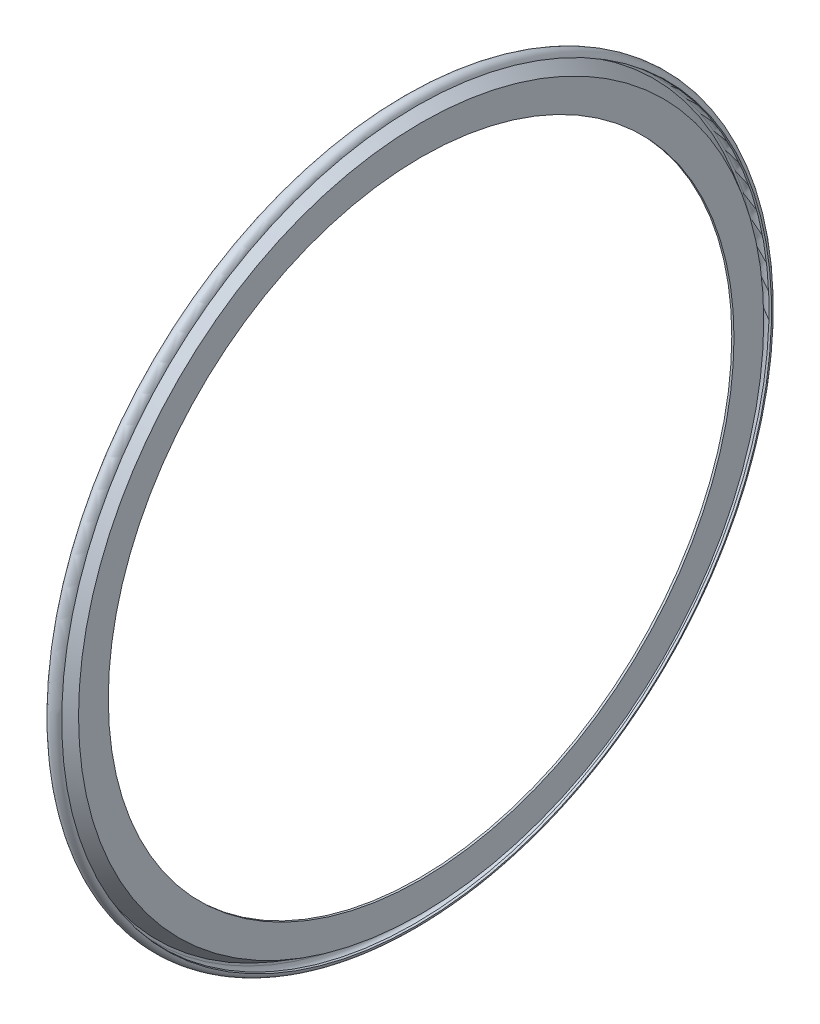
ISO-10303-21;
HEADER;
FILE_DESCRIPTION(('STEP AP214'),'2;1');
FILE_NAME('part.step','',(''),(''),'','','');
FILE_SCHEMA(('AUTOMOTIVE_DESIGN { 1 0 10303 214 1 1 1 1 }'));
ENDSEC;
DATA;
#1=APPLICATION_CONTEXT('core data for automotive mechanical design processes');
#2=APPLICATION_PROTOCOL_DEFINITION('international standard','automotive_design',2000,#1);
#3=PRODUCT_CONTEXT('',#1,'mechanical');
#4=PRODUCT('Part','Part','',(#3));
#5=PRODUCT_RELATED_PRODUCT_CATEGORY('part','',(#4));
#6=PRODUCT_DEFINITION_FORMATION('','',#4);
#7=PRODUCT_DEFINITION_CONTEXT('part definition',#1,'design');
#8=PRODUCT_DEFINITION('design','',#6,#7);
#9=PRODUCT_DEFINITION_SHAPE('','',#8);
#10=(LENGTH_UNIT() NAMED_UNIT(*) SI_UNIT(.MILLI.,.METRE.));
#11=(NAMED_UNIT(*) PLANE_ANGLE_UNIT() SI_UNIT($,.RADIAN.));
#12=(NAMED_UNIT(*) SI_UNIT($,.STERADIAN.) SOLID_ANGLE_UNIT());
#13=UNCERTAINTY_MEASURE_WITH_UNIT(LENGTH_MEASURE(1.E-05),#10,'distance_accuracy_value','');
#14=(GEOMETRIC_REPRESENTATION_CONTEXT(3) GLOBAL_UNCERTAINTY_ASSIGNED_CONTEXT((#13)) GLOBAL_UNIT_ASSIGNED_CONTEXT((#10,
#11,#12)) REPRESENTATION_CONTEXT('',''));
#15=CARTESIAN_POINT('',(0.,0.,0.));
#16=DIRECTION('',(0.,0.,1.));
#17=DIRECTION('',(1.,0.,0.));
#18=AXIS2_PLACEMENT_3D('',#15,#16,#17);
#19=CARTESIAN_POINT('',(2.955,0.,0.));
#20=DIRECTION('',(1.,0.,0.));
#21=DIRECTION('',(0.,1.,0.));
#22=AXIS2_PLACEMENT_3D('',#19,#20,#21);
#23=CYLINDRICAL_SURFACE('',#22,4.245);
#24=CARTESIAN_POINT('',(2.94,0.,0.));
#25=DIRECTION('',(-1.,0.,0.));
#26=DIRECTION('',(0.,1.,0.));
#27=AXIS2_PLACEMENT_3D('',#24,#25,#26);
#28=CIRCLE('',#27,4.245);
#29=CARTESIAN_POINT('',(2.94,4.245,0.));
#30=VERTEX_POINT('',#29);
#31=EDGE_CURVE('E10',#30,#30,#28,.T.);
#32=ORIENTED_EDGE('',*,*,#31,.T.);
#33=EDGE_LOOP('',(#32));
#34=FACE_BOUND('',#33,.T.);
#35=CARTESIAN_POINT('',(2.97,0.,0.));
#36=DIRECTION('',(-1.,0.,0.));
#37=DIRECTION('',(0.,1.,0.));
#38=AXIS2_PLACEMENT_3D('',#35,#36,#37);
#39=CIRCLE('',#38,4.245);
#40=CARTESIAN_POINT('',(2.97,4.245,0.));
#41=VERTEX_POINT('',#40);
#42=EDGE_CURVE('E59',#41,#41,#39,.T.);
#43=ORIENTED_EDGE('',*,*,#42,.F.);
#44=EDGE_LOOP('',(#43));
#45=FACE_BOUND('',#44,.T.);
#46=ADVANCED_FACE('F16',(#34,#45),#23,.F.);
#47=CARTESIAN_POINT('',(2.94,4.43821796769724,0.));
#48=DIRECTION('',(-1.,0.,0.));
#49=DIRECTION('',(0.,1.,0.));
#50=AXIS2_PLACEMENT_3D('',#47,#48,#49);
#51=PLANE('',#50);
#52=CARTESIAN_POINT('',(2.94,0.,0.));
#53=DIRECTION('',(-1.,0.,0.));
#54=DIRECTION('',(0.,1.,0.));
#55=AXIS2_PLACEMENT_3D('',#52,#53,#54);
#56=CIRCLE('',#55,4.63143593539449);
#57=CARTESIAN_POINT('',(2.94,4.63143593539449,0.));
#58=VERTEX_POINT('',#57);
#59=EDGE_CURVE('E26',#58,#58,#56,.T.);
#60=ORIENTED_EDGE('',*,*,#59,.T.);
#61=EDGE_LOOP('',(#60));
#62=FACE_BOUND('',#61,.T.);
#63=ORIENTED_EDGE('',*,*,#31,.F.);
#64=EDGE_LOOP('',(#63));
#65=FACE_BOUND('',#64,.T.);
#66=ADVANCED_FACE('F88',(#62,#65),#51,.T.);
#67=CARTESIAN_POINT('',(2.835,0.,0.));
#68=DIRECTION('',(-1.,0.,0.));
#69=DIRECTION('',(0.,1.,0.));
#70=AXIS2_PLACEMENT_3D('',#67,#68,#69);
#71=CONICAL_SURFACE('',#70,4.6920577136594,0.523598775598299);
#72=CARTESIAN_POINT('',(2.73,0.,0.));
#73=DIRECTION('',(-1.,0.,0.));
#74=DIRECTION('',(0.,1.,0.));
#75=AXIS2_PLACEMENT_3D('',#72,#73,#74);
#76=CIRCLE('',#75,4.75267949192431);
#77=CARTESIAN_POINT('',(2.73,4.75267949192431,0.));
#78=VERTEX_POINT('',#77);
#79=EDGE_CURVE('E67',#78,#78,#76,.T.);
#80=ORIENTED_EDGE('',*,*,#79,.T.);
#81=EDGE_LOOP('',(#80));
#82=FACE_BOUND('',#81,.T.);
#83=ORIENTED_EDGE('',*,*,#59,.F.);
#84=EDGE_LOOP('',(#83));
#85=FACE_BOUND('',#84,.T.);
#86=ADVANCED_FACE('F93',(#82,#85),#71,.F.);
#87=CARTESIAN_POINT('',(2.73,4.77633974596215,0.));
#88=DIRECTION('',(-1.,0.,0.));
#89=DIRECTION('',(0.,1.,0.));
#90=AXIS2_PLACEMENT_3D('',#87,#88,#89);
#91=PLANE('',#90);
#92=CARTESIAN_POINT('',(2.73,0.,0.));
#93=DIRECTION('',(-1.,0.,0.));
#94=DIRECTION('',(0.,1.,0.));
#95=AXIS2_PLACEMENT_3D('',#92,#93,#94);
#96=CIRCLE('',#95,4.8);
#97=CARTESIAN_POINT('',(2.73,4.8,0.));
#98=VERTEX_POINT('',#97);
#99=EDGE_CURVE('E70',#98,#98,#96,.T.);
#100=ORIENTED_EDGE('',*,*,#99,.T.);
#101=EDGE_LOOP('',(#100));
#102=FACE_BOUND('',#101,.T.);
#103=ORIENTED_EDGE('',*,*,#79,.F.);
#104=EDGE_LOOP('',(#103));
#105=FACE_BOUND('',#104,.T.);
#106=ADVANCED_FACE('F98',(#102,#105),#91,.T.);
#107=CARTESIAN_POINT('',(2.82,0.,0.));
#108=DIRECTION('',(-1.,0.,0.));
#109=DIRECTION('',(0.,0.,1.));
#110=AXIS2_PLACEMENT_3D('',#107,#108,#109);
#111=TOROIDAL_SURFACE('',#110,4.8,0.09);
#112=CARTESIAN_POINT('',(2.9086326977711,0.,0.));
#113=DIRECTION('',(-1.,0.,0.));
#114=DIRECTION('',(0.,1.,0.));
#115=AXIS2_PLACEMENT_3D('',#112,#113,#114);
#116=CIRCLE('',#115,4.81562833599002);
#117=CARTESIAN_POINT('',(2.9086326977711,4.81562833599002,0.));
#118=VERTEX_POINT('',#117);
#119=EDGE_CURVE('E20',#118,#118,#116,.T.);
#120=ORIENTED_EDGE('',*,*,#119,.T.);
#121=EDGE_LOOP('',(#120));
#122=FACE_BOUND('',#121,.T.);
#123=ORIENTED_EDGE('',*,*,#99,.F.);
#124=EDGE_LOOP('',(#123));
#125=FACE_BOUND('',#124,.T.);
#126=ADVANCED_FACE('F99',(#122,#125),#111,.T.);
#127=CARTESIAN_POINT('',(2.89386058147592,0.,0.));
#128=DIRECTION('',(1.,0.,0.));
#129=DIRECTION('',(0.,1.,0.));
#130=AXIS2_PLACEMENT_3D('',#127,#128,#129);
#131=CONICAL_SURFACE('',#130,4.81302361332502,0.174532925199443);
#132=CARTESIAN_POINT('',(2.87908846518074,0.,0.));
#133=DIRECTION('',(-1.,0.,0.));
#134=DIRECTION('',(0.,1.,0.));
#135=AXIS2_PLACEMENT_3D('',#132,#133,#134);
#136=CIRCLE('',#135,4.81041889066002);
#137=CARTESIAN_POINT('',(2.87908846518074,4.81041889066002,0.));
#138=VERTEX_POINT('',#137);
#139=EDGE_CURVE('E66',#138,#138,#136,.T.);
#140=ORIENTED_EDGE('',*,*,#139,.T.);
#141=EDGE_LOOP('',(#140));
#142=FACE_BOUND('',#141,.T.);
#143=ORIENTED_EDGE('',*,*,#119,.F.);
#144=EDGE_LOOP('',(#143));
#145=FACE_BOUND('',#144,.T.);
#146=ADVANCED_FACE('F101',(#142,#145),#131,.F.);
#147=CARTESIAN_POINT('',(2.82,0.,0.));
#148=DIRECTION('',(-1.,0.,0.));
#149=DIRECTION('',(0.,0.,1.));
#150=AXIS2_PLACEMENT_3D('',#147,#148,#149);
#151=TOROIDAL_SURFACE('',#150,4.8,0.06);
#152=CARTESIAN_POINT('',(2.76,0.,0.));
#153=DIRECTION('',(-1.,0.,0.));
#154=DIRECTION('',(0.,1.,0.));
#155=AXIS2_PLACEMENT_3D('',#152,#153,#154);
#156=CIRCLE('',#155,4.8);
#157=CARTESIAN_POINT('',(2.76,4.8,0.));
#158=VERTEX_POINT('',#157);
#159=EDGE_CURVE('E64',#158,#158,#156,.T.);
#160=ORIENTED_EDGE('',*,*,#159,.T.);
#161=EDGE_LOOP('',(#160));
#162=FACE_BOUND('',#161,.T.);
#163=ORIENTED_EDGE('',*,*,#139,.F.);
#164=EDGE_LOOP('',(#163));
#165=FACE_BOUND('',#164,.T.);
#166=ADVANCED_FACE('F85',(#162,#165),#151,.F.);
#167=CARTESIAN_POINT('',(2.76,4.785,0.));
#168=DIRECTION('',(1.,0.,0.));
#169=DIRECTION('',(0.,-1.,0.));
#170=AXIS2_PLACEMENT_3D('',#167,#168,#169);
#171=PLANE('',#170);
#172=CARTESIAN_POINT('',(2.76,0.,0.));
#173=DIRECTION('',(-1.,0.,0.));
#174=DIRECTION('',(0.,1.,0.));
#175=AXIS2_PLACEMENT_3D('',#172,#173,#174);
#176=CIRCLE('',#175,4.77);
#177=CARTESIAN_POINT('',(2.76,4.77,0.));
#178=VERTEX_POINT('',#177);
#179=EDGE_CURVE('E61',#178,#178,#176,.T.);
#180=ORIENTED_EDGE('',*,*,#179,.T.);
#181=EDGE_LOOP('',(#180));
#182=FACE_BOUND('',#181,.T.);
#183=ORIENTED_EDGE('',*,*,#159,.F.);
#184=EDGE_LOOP('',(#183));
#185=FACE_BOUND('',#184,.T.);
#186=ADVANCED_FACE('F74',(#182,#185),#171,.T.);
#187=CARTESIAN_POINT('',(2.865,0.,0.));
#188=DIRECTION('',(-1.,0.,0.));
#189=DIRECTION('',(0.,1.,0.));
#190=AXIS2_PLACEMENT_3D('',#187,#188,#189);
#191=CONICAL_SURFACE('',#190,4.70937822173509,0.523598775598299);
#192=CARTESIAN_POINT('',(2.97,0.,0.));
#193=DIRECTION('',(-1.,0.,0.));
#194=DIRECTION('',(0.,1.,0.));
#195=AXIS2_PLACEMENT_3D('',#192,#193,#194);
#196=CIRCLE('',#195,4.64875644347018);
#197=CARTESIAN_POINT('',(2.97,4.64875644347018,0.));
#198=VERTEX_POINT('',#197);
#199=EDGE_CURVE('E56',#198,#198,#196,.T.);
#200=ORIENTED_EDGE('',*,*,#199,.T.);
#201=EDGE_LOOP('',(#200));
#202=FACE_BOUND('',#201,.T.);
#203=ORIENTED_EDGE('',*,*,#179,.F.);
#204=EDGE_LOOP('',(#203));
#205=FACE_BOUND('',#204,.T.);
#206=ADVANCED_FACE('F18',(#202,#205),#191,.T.);
#207=CARTESIAN_POINT('',(2.97,4.44687822173509,0.));
#208=DIRECTION('',(1.,0.,0.));
#209=DIRECTION('',(0.,-1.,0.));
#210=AXIS2_PLACEMENT_3D('',#207,#208,#209);
#211=PLANE('',#210);
#212=ORIENTED_EDGE('',*,*,#42,.T.);
#213=EDGE_LOOP('',(#212));
#214=FACE_BOUND('',#213,.T.);
#215=ORIENTED_EDGE('',*,*,#199,.F.);
#216=EDGE_LOOP('',(#215));
#217=FACE_BOUND('',#216,.T.);
#218=ADVANCED_FACE('F77',(#214,#217),#211,.T.);
#219=CLOSED_SHELL('',(#46,#66,#86,#106,#126,#146,#166,#186,#206,#218));
#220=MANIFOLD_SOLID_BREP('B1',#219);
#221=ADVANCED_BREP_SHAPE_REPRESENTATION('',(#18,#220),#14);
#222=SHAPE_DEFINITION_REPRESENTATION(#9,#221);
ENDSEC;
END-ISO-10303-21;
